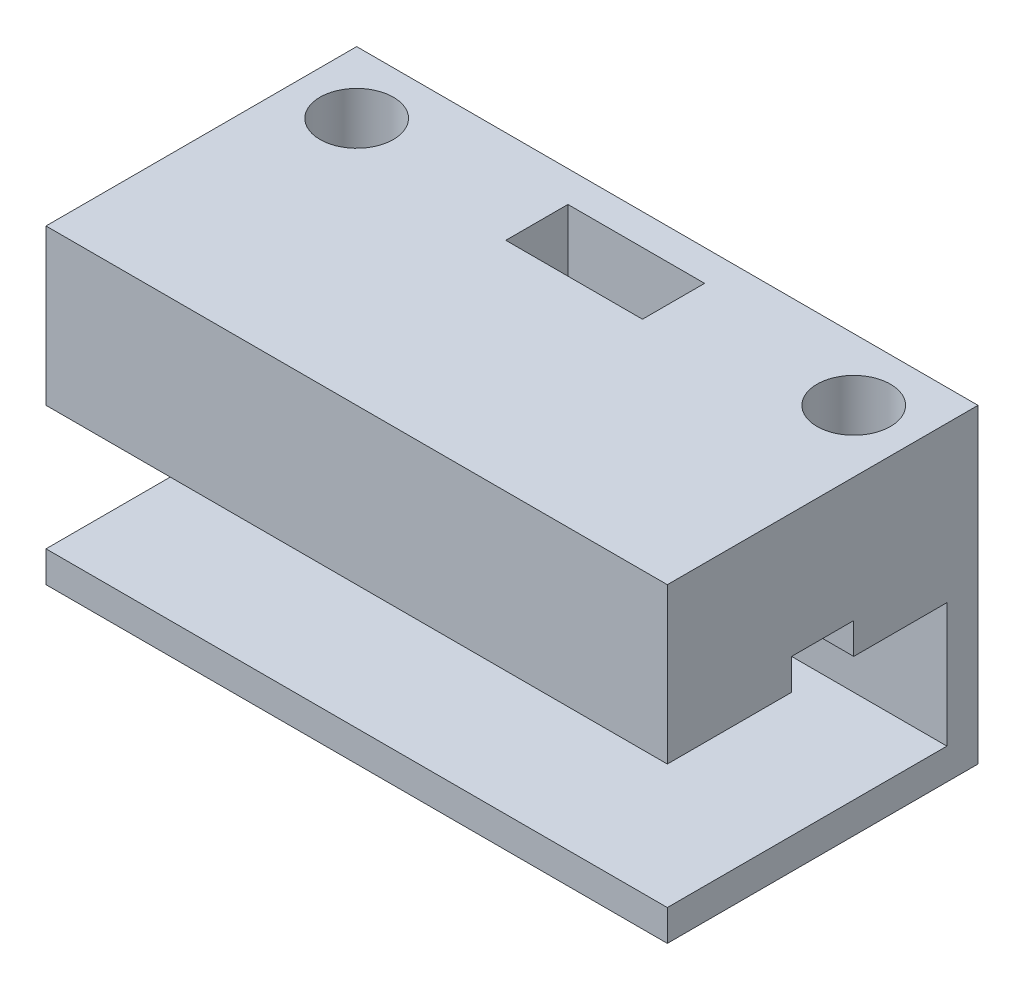
ISO-10303-21;
HEADER;
FILE_DESCRIPTION(('STEP AP214'),'2;1');
FILE_NAME('part.step','',(''),(''),'','','');
FILE_SCHEMA(('AUTOMOTIVE_DESIGN { 1 0 10303 214 1 1 1 1 }'));
ENDSEC;
DATA;
#1=APPLICATION_CONTEXT('core data for automotive mechanical design processes');
#2=APPLICATION_PROTOCOL_DEFINITION('international standard','automotive_design',2000,#1);
#3=PRODUCT_CONTEXT('',#1,'mechanical');
#4=PRODUCT('Part','Part','',(#3));
#5=PRODUCT_RELATED_PRODUCT_CATEGORY('part','',(#4));
#6=PRODUCT_DEFINITION_FORMATION('','',#4);
#7=PRODUCT_DEFINITION_CONTEXT('part definition',#1,'design');
#8=PRODUCT_DEFINITION('design','',#6,#7);
#9=PRODUCT_DEFINITION_SHAPE('','',#8);
#10=(LENGTH_UNIT() NAMED_UNIT(*) SI_UNIT(.MILLI.,.METRE.));
#11=(NAMED_UNIT(*) PLANE_ANGLE_UNIT() SI_UNIT($,.RADIAN.));
#12=(NAMED_UNIT(*) SI_UNIT($,.STERADIAN.) SOLID_ANGLE_UNIT());
#13=UNCERTAINTY_MEASURE_WITH_UNIT(LENGTH_MEASURE(1.E-05),#10,'distance_accuracy_value','');
#14=(GEOMETRIC_REPRESENTATION_CONTEXT(3) GLOBAL_UNCERTAINTY_ASSIGNED_CONTEXT((#13)) GLOBAL_UNIT_ASSIGNED_CONTEXT((#10,
#11,#12)) REPRESENTATION_CONTEXT('',''));
#15=CARTESIAN_POINT('',(0.,0.,0.));
#16=DIRECTION('',(0.,0.,1.));
#17=DIRECTION('',(1.,0.,0.));
#18=AXIS2_PLACEMENT_3D('',#15,#16,#17);
#19=CARTESIAN_POINT('',(-14.732,0.,12.7));
#20=DIRECTION('',(0.,1.,0.));
#21=DIRECTION('',(0.,0.,1.));
#22=AXIS2_PLACEMENT_3D('',#19,#20,#21);
#23=PLANE('',#22);
#24=DIRECTION('',(0.,0.,1.));
#25=VECTOR('',#24,1.);
#26=CARTESIAN_POINT('',(12.7,0.,12.7));
#27=LINE('',#26,#25);
#28=CARTESIAN_POINT('',(12.7,0.,1.27));
#29=VERTEX_POINT('',#28);
#30=CARTESIAN_POINT('',(12.7,0.,5.08));
#31=VERTEX_POINT('',#30);
#32=EDGE_CURVE('E224',#29,#31,#27,.T.);
#33=ORIENTED_EDGE('',*,*,#32,.T.);
#34=DIRECTION('',(-1.,0.,0.));
#35=VECTOR('',#34,1.);
#36=CARTESIAN_POINT('',(-14.732,0.,5.08));
#37=LINE('',#36,#35);
#38=CARTESIAN_POINT('',(-12.7,0.,5.08));
#39=VERTEX_POINT('',#38);
#40=EDGE_CURVE('E48',#31,#39,#37,.T.);
#41=ORIENTED_EDGE('',*,*,#40,.T.);
#42=DIRECTION('',(0.,0.,1.));
#43=VECTOR('',#42,1.);
#44=CARTESIAN_POINT('',(-12.7,0.,12.7));
#45=LINE('',#44,#43);
#46=CARTESIAN_POINT('',(-12.7,0.,1.27));
#47=VERTEX_POINT('',#46);
#48=EDGE_CURVE('E240',#47,#39,#45,.T.);
#49=ORIENTED_EDGE('',*,*,#48,.F.);
#50=DIRECTION('',(1.,0.,0.));
#51=VECTOR('',#50,1.);
#52=CARTESIAN_POINT('',(-14.732,0.,1.27));
#53=LINE('',#52,#51);
#54=CARTESIAN_POINT('',(-2.794,0.,1.27));
#55=VERTEX_POINT('',#54);
#56=EDGE_CURVE('E228',#47,#55,#53,.T.);
#57=ORIENTED_EDGE('',*,*,#56,.T.);
#58=DIRECTION('',(0.,0.,1.));
#59=VECTOR('',#58,1.);
#60=CARTESIAN_POINT('',(-2.794,0.,12.7));
#61=LINE('',#60,#59);
#62=CARTESIAN_POINT('',(-2.794,0.,3.81));
#63=VERTEX_POINT('',#62);
#64=EDGE_CURVE('E325',#55,#63,#61,.T.);
#65=ORIENTED_EDGE('',*,*,#64,.T.);
#66=DIRECTION('',(1.,0.,0.));
#67=VECTOR('',#66,1.);
#68=CARTESIAN_POINT('',(-14.732,0.,3.81000000000001));
#69=LINE('',#68,#67);
#70=CARTESIAN_POINT('',(2.794,0.,3.81));
#71=VERTEX_POINT('',#70);
#72=EDGE_CURVE('E317',#63,#71,#69,.T.);
#73=ORIENTED_EDGE('',*,*,#72,.T.);
#74=DIRECTION('',(0.,0.,-1.));
#75=VECTOR('',#74,1.);
#76=CARTESIAN_POINT('',(2.794,0.,12.7));
#77=LINE('',#76,#75);
#78=CARTESIAN_POINT('',(2.794,0.,1.27));
#79=VERTEX_POINT('',#78);
#80=EDGE_CURVE('E321',#71,#79,#77,.T.);
#81=ORIENTED_EDGE('',*,*,#80,.T.);
#82=EDGE_CURVE('E233',#79,#29,#53,.T.);
#83=ORIENTED_EDGE('',*,*,#82,.T.);
#84=EDGE_LOOP('',(#33,#41,#49,#57,#65,#73,#81,#83));
#85=FACE_BOUND('',#84,.T.);
#86=ADVANCED_FACE('F39',(#85),#23,.F.);
#87=CARTESIAN_POINT('',(0.,0.,12.7));
#88=DIRECTION('',(0.,0.,-1.));
#89=DIRECTION('',(-1.,0.,0.));
#90=AXIS2_PLACEMENT_3D('',#87,#88,#89);
#91=PLANE('',#90);
#92=DIRECTION('',(0.,-1.,0.));
#93=VECTOR('',#92,1.);
#94=CARTESIAN_POINT('',(-12.7,-6.35,12.7));
#95=LINE('',#94,#93);
#96=CARTESIAN_POINT('',(-12.7,6.35,12.7));
#97=VERTEX_POINT('',#96);
#98=CARTESIAN_POINT('',(-12.7,0.,12.7));
#99=VERTEX_POINT('',#98);
#100=EDGE_CURVE('E270',#97,#99,#95,.T.);
#101=ORIENTED_EDGE('',*,*,#100,.T.);
#102=DIRECTION('',(1.,0.,0.));
#103=VECTOR('',#102,1.);
#104=CARTESIAN_POINT('',(0.,0.,12.7));
#105=LINE('',#104,#103);
#106=CARTESIAN_POINT('',(12.7,0.,12.7));
#107=VERTEX_POINT('',#106);
#108=EDGE_CURVE('E309',#99,#107,#105,.T.);
#109=ORIENTED_EDGE('',*,*,#108,.T.);
#110=DIRECTION('',(0.,1.,0.));
#111=VECTOR('',#110,1.);
#112=CARTESIAN_POINT('',(12.7,-6.35,12.7));
#113=LINE('',#112,#111);
#114=CARTESIAN_POINT('',(12.7,6.35,12.7));
#115=VERTEX_POINT('',#114);
#116=EDGE_CURVE('E266',#107,#115,#113,.T.);
#117=ORIENTED_EDGE('',*,*,#116,.T.);
#118=DIRECTION('',(-1.,0.,0.));
#119=VECTOR('',#118,1.);
#120=CARTESIAN_POINT('',(-12.7,6.35,12.7));
#121=LINE('',#120,#119);
#122=EDGE_CURVE('E265',#115,#97,#121,.T.);
#123=ORIENTED_EDGE('',*,*,#122,.T.);
#124=EDGE_LOOP('',(#101,#109,#117,#123));
#125=FACE_BOUND('',#124,.T.);
#126=ADVANCED_FACE('F355',(#125),#91,.F.);
#127=CARTESIAN_POINT('',(12.7,-6.35,12.7));
#128=DIRECTION('',(-1.,0.,0.));
#129=DIRECTION('',(0.,0.,1.));
#130=AXIS2_PLACEMENT_3D('',#127,#128,#129);
#131=PLANE('',#130);
#132=DIRECTION('',(0.,0.,1.));
#133=VECTOR('',#132,1.);
#134=CARTESIAN_POINT('',(12.7,1.27,5.08));
#135=LINE('',#134,#133);
#136=CARTESIAN_POINT('',(12.7,1.27,5.08));
#137=VERTEX_POINT('',#136);
#138=CARTESIAN_POINT('',(12.7,1.27,7.62));
#139=VERTEX_POINT('',#138);
#140=EDGE_CURVE('E159',#137,#139,#135,.T.);
#141=ORIENTED_EDGE('',*,*,#140,.F.);
#142=DIRECTION('',(0.,1.,0.));
#143=VECTOR('',#142,1.);
#144=CARTESIAN_POINT('',(12.7,1.27,5.08));
#145=LINE('',#144,#143);
#146=EDGE_CURVE('E166',#31,#137,#145,.T.);
#147=ORIENTED_EDGE('',*,*,#146,.F.);
#148=ORIENTED_EDGE('',*,*,#32,.F.);
#149=DIRECTION('',(0.,1.,0.));
#150=VECTOR('',#149,1.);
#151=CARTESIAN_POINT('',(12.7,-5.08,1.27));
#152=LINE('',#151,#150);
#153=CARTESIAN_POINT('',(12.7,-5.08,1.27));
#154=VERTEX_POINT('',#153);
#155=EDGE_CURVE('E219',#154,#29,#152,.T.);
#156=ORIENTED_EDGE('',*,*,#155,.F.);
#157=DIRECTION('',(0.,0.,-1.));
#158=VECTOR('',#157,1.);
#159=CARTESIAN_POINT('',(12.7,-5.08,12.7));
#160=LINE('',#159,#158);
#161=CARTESIAN_POINT('',(12.7,-5.08,12.7));
#162=VERTEX_POINT('',#161);
#163=EDGE_CURVE('E207',#162,#154,#160,.T.);
#164=ORIENTED_EDGE('',*,*,#163,.F.);
#165=CARTESIAN_POINT('',(12.7,-6.35,12.7));
#166=VERTEX_POINT('',#165);
#167=EDGE_CURVE('E261',#166,#162,#113,.T.);
#168=ORIENTED_EDGE('',*,*,#167,.F.);
#169=DIRECTION('',(0.,0.,-1.));
#170=VECTOR('',#169,1.);
#171=CARTESIAN_POINT('',(12.7,-6.35,12.7));
#172=LINE('',#171,#170);
#173=CARTESIAN_POINT('',(12.7,-6.35,0.));
#174=VERTEX_POINT('',#173);
#175=EDGE_CURVE('E277',#166,#174,#172,.T.);
#176=ORIENTED_EDGE('',*,*,#175,.T.);
#177=DIRECTION('',(0.,1.,0.));
#178=VECTOR('',#177,1.);
#179=CARTESIAN_POINT('',(12.7,-6.35,0.));
#180=LINE('',#179,#178);
#181=CARTESIAN_POINT('',(12.7,6.35,0.));
#182=VERTEX_POINT('',#181);
#183=EDGE_CURVE('E249',#174,#182,#180,.T.);
#184=ORIENTED_EDGE('',*,*,#183,.T.);
#185=DIRECTION('',(0.,0.,-1.));
#186=VECTOR('',#185,1.);
#187=CARTESIAN_POINT('',(12.7,6.35,12.7));
#188=LINE('',#187,#186);
#189=EDGE_CURVE('E301',#115,#182,#188,.T.);
#190=ORIENTED_EDGE('',*,*,#189,.F.);
#191=ORIENTED_EDGE('',*,*,#116,.F.);
#192=CARTESIAN_POINT('',(12.7,0.,7.62));
#193=VERTEX_POINT('',#192);
#194=EDGE_CURVE('E223',#193,#107,#27,.T.);
#195=ORIENTED_EDGE('',*,*,#194,.F.);
#196=DIRECTION('',(0.,-1.,0.));
#197=VECTOR('',#196,1.);
#198=CARTESIAN_POINT('',(12.7,1.27,7.62));
#199=LINE('',#198,#197);
#200=EDGE_CURVE('E55',#139,#193,#199,.T.);
#201=ORIENTED_EDGE('',*,*,#200,.F.);
#202=EDGE_LOOP('',(#141,#147,#148,#156,#164,#168,#176,#184,#190,#191,#195,#201));
#203=FACE_BOUND('',#202,.T.);
#204=ADVANCED_FACE('F41',(#203),#131,.F.);
#205=CARTESIAN_POINT('',(-12.7,6.35,12.7));
#206=DIRECTION('',(0.,-1.,0.));
#207=DIRECTION('',(0.,0.,-1.));
#208=AXIS2_PLACEMENT_3D('',#205,#206,#207);
#209=PLANE('',#208);
#210=DIRECTION('',(1.,0.,0.));
#211=VECTOR('',#210,1.);
#212=CARTESIAN_POINT('',(2.794,6.35,3.81));
#213=LINE('',#212,#211);
#214=CARTESIAN_POINT('',(-2.794,6.35,3.81));
#215=VERTEX_POINT('',#214);
#216=CARTESIAN_POINT('',(2.794,6.35,3.81));
#217=VERTEX_POINT('',#216);
#218=EDGE_CURVE('E191',#215,#217,#213,.T.);
#219=ORIENTED_EDGE('',*,*,#218,.F.);
#220=DIRECTION('',(0.,0.,1.));
#221=VECTOR('',#220,1.);
#222=CARTESIAN_POINT('',(-2.794,6.35,1.27));
#223=LINE('',#222,#221);
#224=CARTESIAN_POINT('',(-2.794,6.35,1.27));
#225=VERTEX_POINT('',#224);
#226=EDGE_CURVE('E63',#225,#215,#223,.T.);
#227=ORIENTED_EDGE('',*,*,#226,.F.);
#228=DIRECTION('',(-1.,0.,0.));
#229=VECTOR('',#228,1.);
#230=CARTESIAN_POINT('',(2.794,6.35,1.27));
#231=LINE('',#230,#229);
#232=CARTESIAN_POINT('',(2.794,6.35,1.27));
#233=VERTEX_POINT('',#232);
#234=EDGE_CURVE('E199',#233,#225,#231,.T.);
#235=ORIENTED_EDGE('',*,*,#234,.F.);
#236=DIRECTION('',(0.,0.,-1.));
#237=VECTOR('',#236,1.);
#238=CARTESIAN_POINT('',(2.794,6.35,1.27));
#239=LINE('',#238,#237);
#240=EDGE_CURVE('E195',#217,#233,#239,.T.);
#241=ORIENTED_EDGE('',*,*,#240,.F.);
#242=EDGE_LOOP('',(#219,#227,#235,#241));
#243=FACE_BOUND('',#242,.T.);
#244=CARTESIAN_POINT('',(-10.16,6.35,2.54));
#245=DIRECTION('',(0.,1.,0.));
#246=DIRECTION('',(0.,0.,1.));
#247=AXIS2_PLACEMENT_3D('',#244,#245,#246);
#248=CIRCLE('',#247,1.5);
#249=CARTESIAN_POINT('',(-10.16,6.35,4.04));
#250=VERTEX_POINT('',#249);
#251=EDGE_CURVE('E250',#250,#250,#248,.T.);
#252=ORIENTED_EDGE('',*,*,#251,.F.);
#253=EDGE_LOOP('',(#252));
#254=FACE_BOUND('',#253,.T.);
#255=CARTESIAN_POINT('',(10.16,6.35,2.54));
#256=DIRECTION('',(0.,1.,0.));
#257=DIRECTION('',(0.,0.,1.));
#258=AXIS2_PLACEMENT_3D('',#255,#256,#257);
#259=CIRCLE('',#258,1.5);
#260=CARTESIAN_POINT('',(10.16,6.35,4.04));
#261=VERTEX_POINT('',#260);
#262=EDGE_CURVE('E244',#261,#261,#259,.T.);
#263=ORIENTED_EDGE('',*,*,#262,.F.);
#264=EDGE_LOOP('',(#263));
#265=FACE_BOUND('',#264,.T.);
#266=DIRECTION('',(-1.,0.,0.));
#267=VECTOR('',#266,1.);
#268=CARTESIAN_POINT('',(-12.7,6.35,0.));
#269=LINE('',#268,#267);
#270=CARTESIAN_POINT('',(-12.7,6.35,0.));
#271=VERTEX_POINT('',#270);
#272=EDGE_CURVE('E281',#182,#271,#269,.T.);
#273=ORIENTED_EDGE('',*,*,#272,.T.);
#274=DIRECTION('',(0.,0.,-1.));
#275=VECTOR('',#274,1.);
#276=CARTESIAN_POINT('',(-12.7,6.35,12.7));
#277=LINE('',#276,#275);
#278=EDGE_CURVE('E297',#97,#271,#277,.T.);
#279=ORIENTED_EDGE('',*,*,#278,.F.);
#280=ORIENTED_EDGE('',*,*,#122,.F.);
#281=ORIENTED_EDGE('',*,*,#189,.T.);
#282=EDGE_LOOP('',(#273,#279,#280,#281));
#283=FACE_BOUND('',#282,.T.);
#284=ADVANCED_FACE('F415',(#243,#254,#265,#283),#209,.F.);
#285=CARTESIAN_POINT('',(-12.7,-6.35,12.7));
#286=DIRECTION('',(1.,0.,0.));
#287=DIRECTION('',(0.,0.,-1.));
#288=AXIS2_PLACEMENT_3D('',#285,#286,#287);
#289=PLANE('',#288);
#290=ORIENTED_EDGE('',*,*,#48,.T.);
#291=DIRECTION('',(0.,1.,0.));
#292=VECTOR('',#291,1.);
#293=CARTESIAN_POINT('',(-12.7,-6.35,5.08));
#294=LINE('',#293,#292);
#295=CARTESIAN_POINT('',(-12.7,1.27,5.08));
#296=VERTEX_POINT('',#295);
#297=EDGE_CURVE('E186',#39,#296,#294,.T.);
#298=ORIENTED_EDGE('',*,*,#297,.T.);
#299=DIRECTION('',(0.,0.,1.));
#300=VECTOR('',#299,1.);
#301=CARTESIAN_POINT('',(-12.7,1.27,12.7));
#302=LINE('',#301,#300);
#303=CARTESIAN_POINT('',(-12.7,1.27,7.62));
#304=VERTEX_POINT('',#303);
#305=EDGE_CURVE('E11',#296,#304,#302,.T.);
#306=ORIENTED_EDGE('',*,*,#305,.T.);
#307=DIRECTION('',(0.,-1.,0.));
#308=VECTOR('',#307,1.);
#309=CARTESIAN_POINT('',(-12.7,-6.35,7.62));
#310=LINE('',#309,#308);
#311=CARTESIAN_POINT('',(-12.7,0.,7.62));
#312=VERTEX_POINT('',#311);
#313=EDGE_CURVE('E181',#304,#312,#310,.T.);
#314=ORIENTED_EDGE('',*,*,#313,.T.);
#315=EDGE_CURVE('E239',#312,#99,#45,.T.);
#316=ORIENTED_EDGE('',*,*,#315,.T.);
#317=ORIENTED_EDGE('',*,*,#100,.F.);
#318=ORIENTED_EDGE('',*,*,#278,.T.);
#319=DIRECTION('',(0.,-1.,0.));
#320=VECTOR('',#319,1.);
#321=CARTESIAN_POINT('',(-12.7,-6.35,0.));
#322=LINE('',#321,#320);
#323=CARTESIAN_POINT('',(-12.7,-6.35,0.));
#324=VERTEX_POINT('',#323);
#325=EDGE_CURVE('E284',#271,#324,#322,.T.);
#326=ORIENTED_EDGE('',*,*,#325,.T.);
#327=DIRECTION('',(0.,0.,-1.));
#328=VECTOR('',#327,1.);
#329=CARTESIAN_POINT('',(-12.7,-6.35,12.7));
#330=LINE('',#329,#328);
#331=CARTESIAN_POINT('',(-12.7,-6.35,12.7));
#332=VERTEX_POINT('',#331);
#333=EDGE_CURVE('E293',#332,#324,#330,.T.);
#334=ORIENTED_EDGE('',*,*,#333,.F.);
#335=CARTESIAN_POINT('',(-12.7,-5.08,12.7));
#336=VERTEX_POINT('',#335);
#337=EDGE_CURVE('E269',#336,#332,#95,.T.);
#338=ORIENTED_EDGE('',*,*,#337,.F.);
#339=DIRECTION('',(0.,0.,-1.));
#340=VECTOR('',#339,1.);
#341=CARTESIAN_POINT('',(-12.7,-5.08,12.7));
#342=LINE('',#341,#340);
#343=CARTESIAN_POINT('',(-12.7,-5.08,1.27));
#344=VERTEX_POINT('',#343);
#345=EDGE_CURVE('E232',#336,#344,#342,.T.);
#346=ORIENTED_EDGE('',*,*,#345,.T.);
#347=DIRECTION('',(0.,1.,0.));
#348=VECTOR('',#347,1.);
#349=CARTESIAN_POINT('',(-12.7,-6.35,1.27));
#350=LINE('',#349,#348);
#351=EDGE_CURVE('E313',#344,#47,#350,.T.);
#352=ORIENTED_EDGE('',*,*,#351,.T.);
#353=EDGE_LOOP('',(#290,#298,#306,#314,#316,#317,#318,#326,#334,#338,#346,#352));
#354=FACE_BOUND('',#353,.T.);
#355=ADVANCED_FACE('F335',(#354),#289,.F.);
#356=CARTESIAN_POINT('',(-12.7,-6.35,12.7));
#357=DIRECTION('',(0.,1.,0.));
#358=DIRECTION('',(0.,0.,1.));
#359=AXIS2_PLACEMENT_3D('',#356,#357,#358);
#360=PLANE('',#359);
#361=DIRECTION('',(1.,0.,0.));
#362=VECTOR('',#361,1.);
#363=CARTESIAN_POINT('',(-12.7,-6.35,0.));
#364=LINE('',#363,#362);
#365=EDGE_CURVE('E287',#324,#174,#364,.T.);
#366=ORIENTED_EDGE('',*,*,#365,.T.);
#367=ORIENTED_EDGE('',*,*,#175,.F.);
#368=DIRECTION('',(1.,0.,0.));
#369=VECTOR('',#368,1.);
#370=CARTESIAN_POINT('',(-12.7,-6.35,12.7));
#371=LINE('',#370,#369);
#372=EDGE_CURVE('E274',#332,#166,#371,.T.);
#373=ORIENTED_EDGE('',*,*,#372,.F.);
#374=ORIENTED_EDGE('',*,*,#333,.T.);
#375=EDGE_LOOP('',(#366,#367,#373,#374));
#376=FACE_BOUND('',#375,.T.);
#377=ADVANCED_FACE('F406',(#376),#360,.F.);
#378=ORIENTED_EDGE('',*,*,#167,.T.);
#379=DIRECTION('',(-1.,0.,0.));
#380=VECTOR('',#379,1.);
#381=CARTESIAN_POINT('',(0.,-5.08,12.7));
#382=LINE('',#381,#380);
#383=EDGE_CURVE('E305',#162,#336,#382,.T.);
#384=ORIENTED_EDGE('',*,*,#383,.T.);
#385=ORIENTED_EDGE('',*,*,#337,.T.);
#386=ORIENTED_EDGE('',*,*,#372,.T.);
#387=EDGE_LOOP('',(#378,#384,#385,#386));
#388=FACE_BOUND('',#387,.T.);
#389=ADVANCED_FACE('F375',(#388),#91,.F.);
#390=CARTESIAN_POINT('',(0.,0.,0.));
#391=DIRECTION('',(0.,0.,-1.));
#392=DIRECTION('',(-1.,0.,0.));
#393=AXIS2_PLACEMENT_3D('',#390,#391,#392);
#394=PLANE('',#393);
#395=ORIENTED_EDGE('',*,*,#183,.F.);
#396=ORIENTED_EDGE('',*,*,#365,.F.);
#397=ORIENTED_EDGE('',*,*,#325,.F.);
#398=ORIENTED_EDGE('',*,*,#272,.F.);
#399=EDGE_LOOP('',(#395,#396,#397,#398));
#400=FACE_BOUND('',#399,.T.);
#401=ADVANCED_FACE('F402',(#400),#394,.T.);
#402=CARTESIAN_POINT('',(10.16,1.27,2.54));
#403=DIRECTION('',(0.,1.,0.));
#404=DIRECTION('',(0.,0.,1.));
#405=AXIS2_PLACEMENT_3D('',#402,#403,#404);
#406=CYLINDRICAL_SURFACE('',#405,1.5);
#407=CARTESIAN_POINT('',(10.16,1.27,2.54));
#408=DIRECTION('',(0.,1.,0.));
#409=DIRECTION('',(0.,0.,1.));
#410=AXIS2_PLACEMENT_3D('',#407,#408,#409);
#411=CIRCLE('',#410,1.5);
#412=CARTESIAN_POINT('',(10.16,1.27,4.04));
#413=VERTEX_POINT('',#412);
#414=EDGE_CURVE('E254',#413,#413,#411,.T.);
#415=ORIENTED_EDGE('',*,*,#414,.F.);
#416=EDGE_LOOP('',(#415));
#417=FACE_BOUND('',#416,.T.);
#418=ORIENTED_EDGE('',*,*,#262,.T.);
#419=EDGE_LOOP('',(#418));
#420=FACE_BOUND('',#419,.T.);
#421=ADVANCED_FACE('F399',(#417,#420),#406,.F.);
#422=CARTESIAN_POINT('',(10.16,1.27,2.54));
#423=DIRECTION('',(0.,1.,0.));
#424=DIRECTION('',(0.,0.,1.));
#425=AXIS2_PLACEMENT_3D('',#422,#423,#424);
#426=PLANE('',#425);
#427=ORIENTED_EDGE('',*,*,#414,.T.);
#428=EDGE_LOOP('',(#427));
#429=FACE_BOUND('',#428,.T.);
#430=ADVANCED_FACE('F395',(#429),#426,.T.);
#431=CARTESIAN_POINT('',(-10.16,1.27,2.54));
#432=DIRECTION('',(0.,1.,0.));
#433=DIRECTION('',(0.,0.,1.));
#434=AXIS2_PLACEMENT_3D('',#431,#432,#433);
#435=CYLINDRICAL_SURFACE('',#434,1.5);
#436=CARTESIAN_POINT('',(-10.16,1.27,2.54));
#437=DIRECTION('',(0.,1.,0.));
#438=DIRECTION('',(0.,0.,1.));
#439=AXIS2_PLACEMENT_3D('',#436,#437,#438);
#440=CIRCLE('',#439,1.5);
#441=CARTESIAN_POINT('',(-10.16,1.27,4.04));
#442=VERTEX_POINT('',#441);
#443=EDGE_CURVE('E245',#442,#442,#440,.T.);
#444=ORIENTED_EDGE('',*,*,#443,.F.);
#445=EDGE_LOOP('',(#444));
#446=FACE_BOUND('',#445,.T.);
#447=ORIENTED_EDGE('',*,*,#251,.T.);
#448=EDGE_LOOP('',(#447));
#449=FACE_BOUND('',#448,.T.);
#450=ADVANCED_FACE('F389',(#446,#449),#435,.F.);
#451=CARTESIAN_POINT('',(-10.16,1.27,2.54));
#452=DIRECTION('',(0.,1.,0.));
#453=DIRECTION('',(0.,0.,1.));
#454=AXIS2_PLACEMENT_3D('',#451,#452,#453);
#455=PLANE('',#454);
#456=ORIENTED_EDGE('',*,*,#443,.T.);
#457=EDGE_LOOP('',(#456));
#458=FACE_BOUND('',#457,.T.);
#459=ADVANCED_FACE('F385',(#458),#455,.T.);
#460=CARTESIAN_POINT('',(-14.732,-5.08,1.27));
#461=DIRECTION('',(0.,0.,-1.));
#462=DIRECTION('',(-1.,0.,0.));
#463=AXIS2_PLACEMENT_3D('',#460,#461,#462);
#464=PLANE('',#463);
#465=DIRECTION('',(0.,1.,0.));
#466=VECTOR('',#465,1.);
#467=CARTESIAN_POINT('',(-2.794,-3.30200000000001,1.27));
#468=LINE('',#467,#466);
#469=EDGE_CURVE('E204',#55,#225,#468,.T.);
#470=ORIENTED_EDGE('',*,*,#469,.F.);
#471=ORIENTED_EDGE('',*,*,#56,.F.);
#472=ORIENTED_EDGE('',*,*,#351,.F.);
#473=DIRECTION('',(1.,0.,0.));
#474=VECTOR('',#473,1.);
#475=CARTESIAN_POINT('',(-14.732,-5.08,1.27));
#476=LINE('',#475,#474);
#477=EDGE_CURVE('E227',#344,#154,#476,.T.);
#478=ORIENTED_EDGE('',*,*,#477,.T.);
#479=ORIENTED_EDGE('',*,*,#155,.T.);
#480=ORIENTED_EDGE('',*,*,#82,.F.);
#481=DIRECTION('',(0.,1.,0.));
#482=VECTOR('',#481,1.);
#483=CARTESIAN_POINT('',(2.794,-3.30200000000001,1.27));
#484=LINE('',#483,#482);
#485=EDGE_CURVE('E208',#79,#233,#484,.T.);
#486=ORIENTED_EDGE('',*,*,#485,.T.);
#487=ORIENTED_EDGE('',*,*,#234,.T.);
#488=EDGE_LOOP('',(#470,#471,#472,#478,#479,#480,#486,#487));
#489=FACE_BOUND('',#488,.T.);
#490=ADVANCED_FACE('F340',(#489),#464,.F.);
#491=ORIENTED_EDGE('',*,*,#315,.F.);
#492=DIRECTION('',(1.,0.,0.));
#493=VECTOR('',#492,1.);
#494=CARTESIAN_POINT('',(-14.732,0.,7.62));
#495=LINE('',#494,#493);
#496=EDGE_CURVE('E329',#312,#193,#495,.T.);
#497=ORIENTED_EDGE('',*,*,#496,.T.);
#498=ORIENTED_EDGE('',*,*,#194,.T.);
#499=ORIENTED_EDGE('',*,*,#108,.F.);
#500=EDGE_LOOP('',(#491,#497,#498,#499));
#501=FACE_BOUND('',#500,.T.);
#502=ADVANCED_FACE('F352',(#501),#23,.F.);
#503=CARTESIAN_POINT('',(-14.732,-5.08,12.7));
#504=DIRECTION('',(0.,-1.,0.));
#505=DIRECTION('',(0.,0.,-1.));
#506=AXIS2_PLACEMENT_3D('',#503,#504,#505);
#507=PLANE('',#506);
#508=ORIENTED_EDGE('',*,*,#383,.F.);
#509=ORIENTED_EDGE('',*,*,#163,.T.);
#510=ORIENTED_EDGE('',*,*,#477,.F.);
#511=ORIENTED_EDGE('',*,*,#345,.F.);
#512=EDGE_LOOP('',(#508,#509,#510,#511));
#513=FACE_BOUND('',#512,.T.);
#514=ADVANCED_FACE('F342',(#513),#507,.F.);
#515=CARTESIAN_POINT('',(-2.794,-3.30200000000001,1.27));
#516=DIRECTION('',(-1.,0.,0.));
#517=DIRECTION('',(0.,0.,1.));
#518=AXIS2_PLACEMENT_3D('',#515,#516,#517);
#519=PLANE('',#518);
#520=ORIENTED_EDGE('',*,*,#469,.T.);
#521=ORIENTED_EDGE('',*,*,#226,.T.);
#522=DIRECTION('',(0.,1.,0.));
#523=VECTOR('',#522,1.);
#524=CARTESIAN_POINT('',(-2.794,-3.30200000000001,3.81));
#525=LINE('',#524,#523);
#526=EDGE_CURVE('E203',#63,#215,#525,.T.);
#527=ORIENTED_EDGE('',*,*,#526,.F.);
#528=ORIENTED_EDGE('',*,*,#64,.F.);
#529=EDGE_LOOP('',(#520,#521,#527,#528));
#530=FACE_BOUND('',#529,.T.);
#531=ADVANCED_FACE('F383',(#530),#519,.F.);
#532=CARTESIAN_POINT('',(2.794,-3.30200000000001,1.27));
#533=DIRECTION('',(1.,0.,0.));
#534=DIRECTION('',(0.,0.,-1.));
#535=AXIS2_PLACEMENT_3D('',#532,#533,#534);
#536=PLANE('',#535);
#537=DIRECTION('',(0.,1.,0.));
#538=VECTOR('',#537,1.);
#539=CARTESIAN_POINT('',(2.794,-3.30200000000001,3.81));
#540=LINE('',#539,#538);
#541=EDGE_CURVE('E211',#71,#217,#540,.T.);
#542=ORIENTED_EDGE('',*,*,#541,.T.);
#543=ORIENTED_EDGE('',*,*,#240,.T.);
#544=ORIENTED_EDGE('',*,*,#485,.F.);
#545=ORIENTED_EDGE('',*,*,#80,.F.);
#546=EDGE_LOOP('',(#542,#543,#544,#545));
#547=FACE_BOUND('',#546,.T.);
#548=ADVANCED_FACE('F443',(#547),#536,.F.);
#549=CARTESIAN_POINT('',(2.794,-3.30200000000001,3.81));
#550=DIRECTION('',(0.,0.,1.));
#551=DIRECTION('',(1.,0.,0.));
#552=AXIS2_PLACEMENT_3D('',#549,#550,#551);
#553=PLANE('',#552);
#554=ORIENTED_EDGE('',*,*,#526,.T.);
#555=ORIENTED_EDGE('',*,*,#218,.T.);
#556=ORIENTED_EDGE('',*,*,#541,.F.);
#557=ORIENTED_EDGE('',*,*,#72,.F.);
#558=EDGE_LOOP('',(#554,#555,#556,#557));
#559=FACE_BOUND('',#558,.T.);
#560=ADVANCED_FACE('F440',(#559),#553,.F.);
#561=CARTESIAN_POINT('',(-14.224,1.27,5.08));
#562=DIRECTION('',(0.,1.,0.));
#563=DIRECTION('',(0.,0.,1.));
#564=AXIS2_PLACEMENT_3D('',#561,#562,#563);
#565=PLANE('',#564);
#566=DIRECTION('',(1.,0.,0.));
#567=VECTOR('',#566,1.);
#568=CARTESIAN_POINT('',(-14.224,1.27,5.08));
#569=LINE('',#568,#567);
#570=EDGE_CURVE('E154',#296,#137,#569,.T.);
#571=ORIENTED_EDGE('',*,*,#570,.T.);
#572=ORIENTED_EDGE('',*,*,#140,.T.);
#573=DIRECTION('',(1.,0.,0.));
#574=VECTOR('',#573,1.);
#575=CARTESIAN_POINT('',(-14.224,1.27,7.62));
#576=LINE('',#575,#574);
#577=EDGE_CURVE('E163',#304,#139,#576,.T.);
#578=ORIENTED_EDGE('',*,*,#577,.F.);
#579=ORIENTED_EDGE('',*,*,#305,.F.);
#580=EDGE_LOOP('',(#571,#572,#578,#579));
#581=FACE_BOUND('',#580,.T.);
#582=ADVANCED_FACE('F156',(#581),#565,.F.);
#583=CARTESIAN_POINT('',(-14.224,1.27,5.08));
#584=DIRECTION('',(0.,0.,-1.));
#585=DIRECTION('',(-1.,0.,0.));
#586=AXIS2_PLACEMENT_3D('',#583,#584,#585);
#587=PLANE('',#586);
#588=ORIENTED_EDGE('',*,*,#40,.F.);
#589=ORIENTED_EDGE('',*,*,#146,.T.);
#590=ORIENTED_EDGE('',*,*,#570,.F.);
#591=ORIENTED_EDGE('',*,*,#297,.F.);
#592=EDGE_LOOP('',(#588,#589,#590,#591));
#593=FACE_BOUND('',#592,.T.);
#594=ADVANCED_FACE('F167',(#593),#587,.F.);
#595=CARTESIAN_POINT('',(-14.224,1.27,7.62));
#596=DIRECTION('',(0.,0.,1.));
#597=DIRECTION('',(1.,0.,0.));
#598=AXIS2_PLACEMENT_3D('',#595,#596,#597);
#599=PLANE('',#598);
#600=ORIENTED_EDGE('',*,*,#577,.T.);
#601=ORIENTED_EDGE('',*,*,#200,.T.);
#602=ORIENTED_EDGE('',*,*,#496,.F.);
#603=ORIENTED_EDGE('',*,*,#313,.F.);
#604=EDGE_LOOP('',(#600,#601,#602,#603));
#605=FACE_BOUND('',#604,.T.);
#606=ADVANCED_FACE('F361',(#605),#599,.F.);
#607=CLOSED_SHELL('',(#86,#126,#204,#284,#355,#377,#389,#401,#421,#430,#450,#459,#490,#502,#514,
#531,#548,#560,#582,#594,#606));
#608=MANIFOLD_SOLID_BREP('B2',#607);
#609=ADVANCED_BREP_SHAPE_REPRESENTATION('',(#18,#608),#14);
#610=SHAPE_DEFINITION_REPRESENTATION(#9,#609);
ENDSEC;
END-ISO-10303-21;
